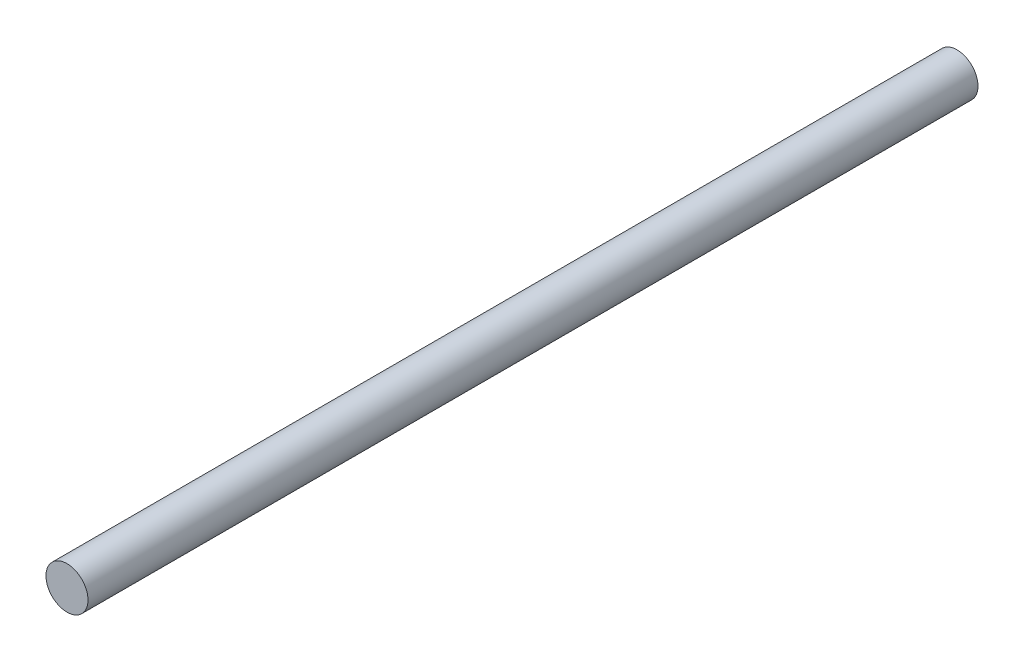
ISO-10303-21;
HEADER;
FILE_DESCRIPTION(('STEP AP214'),'2;1');
FILE_NAME('part.step','',(''),(''),'','','');
FILE_SCHEMA(('AUTOMOTIVE_DESIGN { 1 0 10303 214 1 1 1 1 }'));
ENDSEC;
DATA;
#1=APPLICATION_CONTEXT('core data for automotive mechanical design processes');
#2=APPLICATION_PROTOCOL_DEFINITION('international standard','automotive_design',2000,#1);
#3=PRODUCT_CONTEXT('',#1,'mechanical');
#4=PRODUCT('Part','Part','',(#3));
#5=PRODUCT_RELATED_PRODUCT_CATEGORY('part','',(#4));
#6=PRODUCT_DEFINITION_FORMATION('','',#4);
#7=PRODUCT_DEFINITION_CONTEXT('part definition',#1,'design');
#8=PRODUCT_DEFINITION('design','',#6,#7);
#9=PRODUCT_DEFINITION_SHAPE('','',#8);
#10=(LENGTH_UNIT() NAMED_UNIT(*) SI_UNIT(.MILLI.,.METRE.));
#11=(NAMED_UNIT(*) PLANE_ANGLE_UNIT() SI_UNIT($,.RADIAN.));
#12=(NAMED_UNIT(*) SI_UNIT($,.STERADIAN.) SOLID_ANGLE_UNIT());
#13=UNCERTAINTY_MEASURE_WITH_UNIT(LENGTH_MEASURE(1.E-05),#10,'distance_accuracy_value','');
#14=(GEOMETRIC_REPRESENTATION_CONTEXT(3) GLOBAL_UNCERTAINTY_ASSIGNED_CONTEXT((#13)) GLOBAL_UNIT_ASSIGNED_CONTEXT((#10,
#11,#12)) REPRESENTATION_CONTEXT('',''));
#15=CARTESIAN_POINT('',(0.,0.,0.));
#16=DIRECTION('',(0.,0.,1.));
#17=DIRECTION('',(1.,0.,0.));
#18=AXIS2_PLACEMENT_3D('',#15,#16,#17);
#19=CARTESIAN_POINT('',(0.,0.,127.));
#20=DIRECTION('',(0.,0.,-1.));
#21=DIRECTION('',(-1.,0.,0.));
#22=AXIS2_PLACEMENT_3D('',#19,#20,#21);
#23=CYLINDRICAL_SURFACE('',#22,3.);
#24=CARTESIAN_POINT('',(0.,0.,127.));
#25=DIRECTION('',(0.,0.,1.));
#26=DIRECTION('',(1.,0.,0.));
#27=AXIS2_PLACEMENT_3D('',#24,#25,#26);
#28=CIRCLE('',#27,3.);
#29=CARTESIAN_POINT('',(3.,0.,127.));
#30=VERTEX_POINT('',#29);
#31=EDGE_CURVE('E10',#30,#30,#28,.T.);
#32=ORIENTED_EDGE('',*,*,#31,.F.);
#33=EDGE_LOOP('',(#32));
#34=FACE_BOUND('',#33,.T.);
#35=CARTESIAN_POINT('',(0.,0.,0.));
#36=DIRECTION('',(0.,0.,1.));
#37=DIRECTION('',(1.,0.,0.));
#38=AXIS2_PLACEMENT_3D('',#35,#36,#37);
#39=CIRCLE('',#38,3.);
#40=CARTESIAN_POINT('',(3.,0.,0.));
#41=VERTEX_POINT('',#40);
#42=EDGE_CURVE('E37',#41,#41,#39,.T.);
#43=ORIENTED_EDGE('',*,*,#42,.T.);
#44=EDGE_LOOP('',(#43));
#45=FACE_BOUND('',#44,.T.);
#46=ADVANCED_FACE('F40',(#34,#45),#23,.T.);
#47=CARTESIAN_POINT('',(0.,0.,127.));
#48=DIRECTION('',(0.,0.,1.));
#49=DIRECTION('',(1.,0.,0.));
#50=AXIS2_PLACEMENT_3D('',#47,#48,#49);
#51=PLANE('',#50);
#52=ORIENTED_EDGE('',*,*,#31,.T.);
#53=EDGE_LOOP('',(#52));
#54=FACE_BOUND('',#53,.T.);
#55=ADVANCED_FACE('F55',(#54),#51,.T.);
#56=CARTESIAN_POINT('',(0.,0.,0.));
#57=DIRECTION('',(0.,0.,1.));
#58=DIRECTION('',(1.,0.,0.));
#59=AXIS2_PLACEMENT_3D('',#56,#57,#58);
#60=PLANE('',#59);
#61=ORIENTED_EDGE('',*,*,#42,.F.);
#62=EDGE_LOOP('',(#61));
#63=FACE_BOUND('',#62,.T.);
#64=ADVANCED_FACE('F49',(#63),#60,.F.);
#65=CLOSED_SHELL('',(#46,#55,#64));
#66=MANIFOLD_SOLID_BREP('B2',#65);
#67=ADVANCED_BREP_SHAPE_REPRESENTATION('',(#18,#66),#14);
#68=SHAPE_DEFINITION_REPRESENTATION(#9,#67);
ENDSEC;
END-ISO-10303-21;
